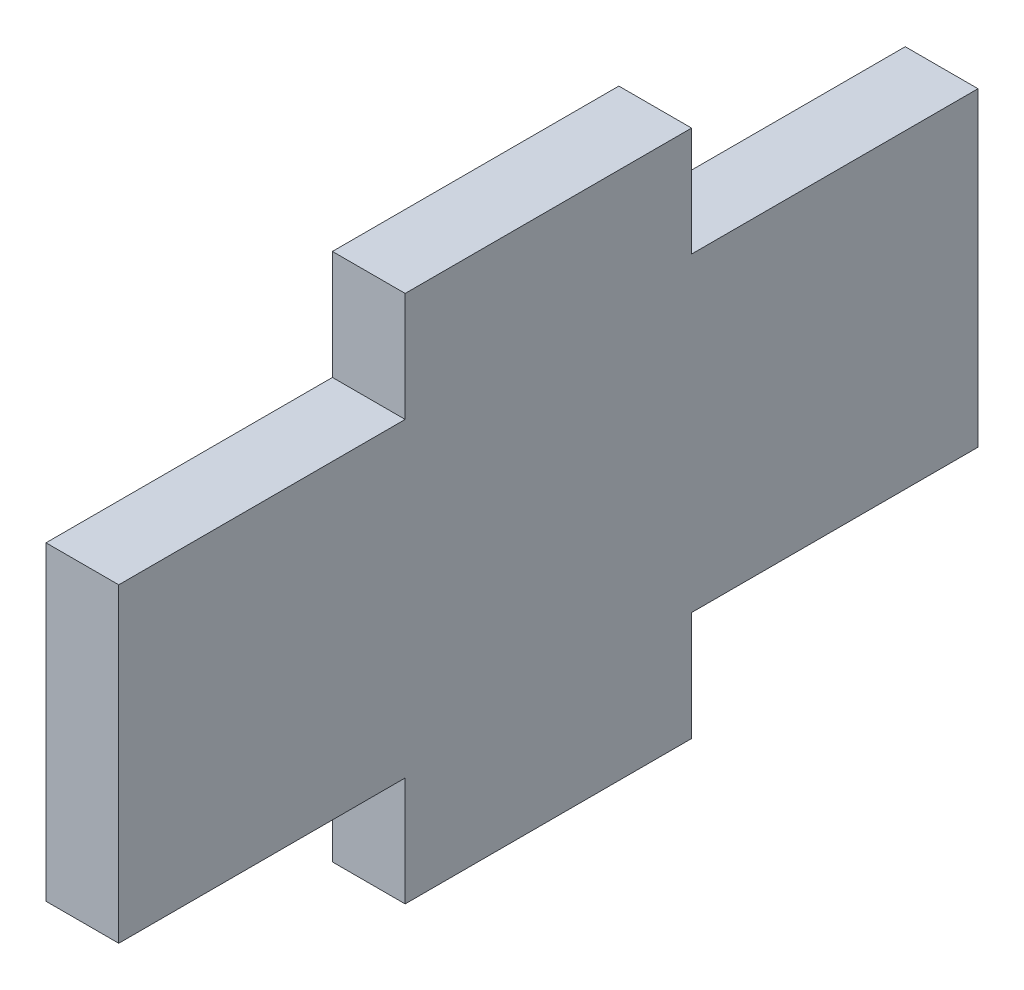
ISO-10303-21;
HEADER;
FILE_DESCRIPTION(('STEP AP214'),'2;1');
FILE_NAME('part.step','',(''),(''),'','','');
FILE_SCHEMA(('AUTOMOTIVE_DESIGN { 1 0 10303 214 1 1 1 1 }'));
ENDSEC;
DATA;
#1=APPLICATION_CONTEXT('core data for automotive mechanical design processes');
#2=APPLICATION_PROTOCOL_DEFINITION('international standard','automotive_design',2000,#1);
#3=PRODUCT_CONTEXT('',#1,'mechanical');
#4=PRODUCT('Part','Part','',(#3));
#5=PRODUCT_RELATED_PRODUCT_CATEGORY('part','',(#4));
#6=PRODUCT_DEFINITION_FORMATION('','',#4);
#7=PRODUCT_DEFINITION_CONTEXT('part definition',#1,'design');
#8=PRODUCT_DEFINITION('design','',#6,#7);
#9=PRODUCT_DEFINITION_SHAPE('','',#8);
#10=(LENGTH_UNIT() NAMED_UNIT(*) SI_UNIT(.MILLI.,.METRE.));
#11=(NAMED_UNIT(*) PLANE_ANGLE_UNIT() SI_UNIT($,.RADIAN.));
#12=(NAMED_UNIT(*) SI_UNIT($,.STERADIAN.) SOLID_ANGLE_UNIT());
#13=UNCERTAINTY_MEASURE_WITH_UNIT(LENGTH_MEASURE(1.E-05),#10,'distance_accuracy_value','');
#14=(GEOMETRIC_REPRESENTATION_CONTEXT(3) GLOBAL_UNCERTAINTY_ASSIGNED_CONTEXT((#13)) GLOBAL_UNIT_ASSIGNED_CONTEXT((#10,
#11,#12)) REPRESENTATION_CONTEXT('',''));
#15=CARTESIAN_POINT('',(0.,0.,0.));
#16=DIRECTION('',(0.,0.,1.));
#17=DIRECTION('',(1.,0.,0.));
#18=AXIS2_PLACEMENT_3D('',#15,#16,#17);
#19=CARTESIAN_POINT('',(3.175,13.55,-37.5));
#20=DIRECTION('',(0.,0.,1.));
#21=DIRECTION('',(1.,0.,0.));
#22=AXIS2_PLACEMENT_3D('',#19,#20,#21);
#23=PLANE('',#22);
#24=DIRECTION('',(0.,1.,0.));
#25=VECTOR('',#24,1.);
#26=CARTESIAN_POINT('',(-3.175,13.55,-37.5));
#27=LINE('',#26,#25);
#28=CARTESIAN_POINT('',(-3.175,-13.55,-37.5));
#29=VERTEX_POINT('',#28);
#30=CARTESIAN_POINT('',(-3.175,13.55,-37.5));
#31=VERTEX_POINT('',#30);
#32=EDGE_CURVE('E136',#29,#31,#27,.T.);
#33=ORIENTED_EDGE('',*,*,#32,.T.);
#34=DIRECTION('',(-1.,0.,0.));
#35=VECTOR('',#34,1.);
#36=CARTESIAN_POINT('',(3.175,13.55,-37.5));
#37=LINE('',#36,#35);
#38=CARTESIAN_POINT('',(3.175,13.55,-37.5));
#39=VERTEX_POINT('',#38);
#40=EDGE_CURVE('E11',#39,#31,#37,.T.);
#41=ORIENTED_EDGE('',*,*,#40,.F.);
#42=DIRECTION('',(0.,1.,0.));
#43=VECTOR('',#42,1.);
#44=CARTESIAN_POINT('',(3.175,13.55,-37.5));
#45=LINE('',#44,#43);
#46=CARTESIAN_POINT('',(3.175,-13.55,-37.5));
#47=VERTEX_POINT('',#46);
#48=EDGE_CURVE('E157',#47,#39,#45,.T.);
#49=ORIENTED_EDGE('',*,*,#48,.F.);
#50=DIRECTION('',(-1.,0.,0.));
#51=VECTOR('',#50,1.);
#52=CARTESIAN_POINT('',(3.175,-13.55,-37.5));
#53=LINE('',#52,#51);
#54=EDGE_CURVE('E257',#47,#29,#53,.T.);
#55=ORIENTED_EDGE('',*,*,#54,.T.);
#56=EDGE_LOOP('',(#33,#41,#49,#55));
#57=FACE_BOUND('',#56,.T.);
#58=ADVANCED_FACE('F39',(#57),#23,.F.);
#59=CARTESIAN_POINT('',(3.175,13.55,-12.5));
#60=DIRECTION('',(0.,-1.,0.));
#61=DIRECTION('',(0.,0.,-1.));
#62=AXIS2_PLACEMENT_3D('',#59,#60,#61);
#63=PLANE('',#62);
#64=DIRECTION('',(0.,0.,1.));
#65=VECTOR('',#64,1.);
#66=CARTESIAN_POINT('',(-3.175,13.55,-12.5));
#67=LINE('',#66,#65);
#68=CARTESIAN_POINT('',(-3.175,13.55,-12.5));
#69=VERTEX_POINT('',#68);
#70=EDGE_CURVE('E140',#31,#69,#67,.T.);
#71=ORIENTED_EDGE('',*,*,#70,.T.);
#72=DIRECTION('',(-1.,0.,0.));
#73=VECTOR('',#72,1.);
#74=CARTESIAN_POINT('',(3.175,13.55,-12.5));
#75=LINE('',#74,#73);
#76=CARTESIAN_POINT('',(3.175,13.55,-12.5));
#77=VERTEX_POINT('',#76);
#78=EDGE_CURVE('E48',#77,#69,#75,.T.);
#79=ORIENTED_EDGE('',*,*,#78,.F.);
#80=DIRECTION('',(0.,0.,1.));
#81=VECTOR('',#80,1.);
#82=CARTESIAN_POINT('',(3.175,13.55,-12.5));
#83=LINE('',#82,#81);
#84=EDGE_CURVE('E94',#39,#77,#83,.T.);
#85=ORIENTED_EDGE('',*,*,#84,.F.);
#86=ORIENTED_EDGE('',*,*,#40,.T.);
#87=EDGE_LOOP('',(#71,#79,#85,#86));
#88=FACE_BOUND('',#87,.T.);
#89=ADVANCED_FACE('F213',(#88),#63,.F.);
#90=CARTESIAN_POINT('',(3.175,23.075,-12.5));
#91=DIRECTION('',(0.,0.,1.));
#92=DIRECTION('',(1.,0.,0.));
#93=AXIS2_PLACEMENT_3D('',#90,#91,#92);
#94=PLANE('',#93);
#95=DIRECTION('',(0.,1.,0.));
#96=VECTOR('',#95,1.);
#97=CARTESIAN_POINT('',(-3.175,23.075,-12.5));
#98=LINE('',#97,#96);
#99=CARTESIAN_POINT('',(-3.175,23.075,-12.5));
#100=VERTEX_POINT('',#99);
#101=EDGE_CURVE('E144',#69,#100,#98,.T.);
#102=ORIENTED_EDGE('',*,*,#101,.T.);
#103=DIRECTION('',(-1.,0.,0.));
#104=VECTOR('',#103,1.);
#105=CARTESIAN_POINT('',(3.175,23.075,-12.5));
#106=LINE('',#105,#104);
#107=CARTESIAN_POINT('',(3.175,23.075,-12.5));
#108=VERTEX_POINT('',#107);
#109=EDGE_CURVE('E122',#108,#100,#106,.T.);
#110=ORIENTED_EDGE('',*,*,#109,.F.);
#111=DIRECTION('',(0.,1.,0.));
#112=VECTOR('',#111,1.);
#113=CARTESIAN_POINT('',(3.175,23.075,-12.5));
#114=LINE('',#113,#112);
#115=EDGE_CURVE('E111',#77,#108,#114,.T.);
#116=ORIENTED_EDGE('',*,*,#115,.F.);
#117=ORIENTED_EDGE('',*,*,#78,.T.);
#118=EDGE_LOOP('',(#102,#110,#116,#117));
#119=FACE_BOUND('',#118,.T.);
#120=ADVANCED_FACE('F167',(#119),#94,.F.);
#121=CARTESIAN_POINT('',(3.175,23.075,12.5));
#122=DIRECTION('',(0.,-1.,0.));
#123=DIRECTION('',(0.,0.,-1.));
#124=AXIS2_PLACEMENT_3D('',#121,#122,#123);
#125=PLANE('',#124);
#126=DIRECTION('',(0.,0.,1.));
#127=VECTOR('',#126,1.);
#128=CARTESIAN_POINT('',(-3.175,23.075,12.5));
#129=LINE('',#128,#127);
#130=CARTESIAN_POINT('',(-3.175,23.075,12.5));
#131=VERTEX_POINT('',#130);
#132=EDGE_CURVE('E120',#100,#131,#129,.T.);
#133=ORIENTED_EDGE('',*,*,#132,.T.);
#134=DIRECTION('',(-1.,0.,0.));
#135=VECTOR('',#134,1.);
#136=CARTESIAN_POINT('',(3.175,23.075,12.5));
#137=LINE('',#136,#135);
#138=CARTESIAN_POINT('',(3.175,23.075,12.5));
#139=VERTEX_POINT('',#138);
#140=EDGE_CURVE('E117',#139,#131,#137,.T.);
#141=ORIENTED_EDGE('',*,*,#140,.F.);
#142=DIRECTION('',(0.,0.,1.));
#143=VECTOR('',#142,1.);
#144=CARTESIAN_POINT('',(3.175,23.075,12.5));
#145=LINE('',#144,#143);
#146=EDGE_CURVE('E105',#108,#139,#145,.T.);
#147=ORIENTED_EDGE('',*,*,#146,.F.);
#148=ORIENTED_EDGE('',*,*,#109,.T.);
#149=EDGE_LOOP('',(#133,#141,#147,#148));
#150=FACE_BOUND('',#149,.T.);
#151=ADVANCED_FACE('F118',(#150),#125,.F.);
#152=CARTESIAN_POINT('',(3.175,13.55,12.5));
#153=DIRECTION('',(0.,0.,-1.));
#154=DIRECTION('',(-1.,0.,0.));
#155=AXIS2_PLACEMENT_3D('',#152,#153,#154);
#156=PLANE('',#155);
#157=DIRECTION('',(0.,-1.,0.));
#158=VECTOR('',#157,1.);
#159=CARTESIAN_POINT('',(-3.175,13.55,12.5));
#160=LINE('',#159,#158);
#161=CARTESIAN_POINT('',(-3.175,13.55,12.5));
#162=VERTEX_POINT('',#161);
#163=EDGE_CURVE('E80',#131,#162,#160,.T.);
#164=ORIENTED_EDGE('',*,*,#163,.T.);
#165=DIRECTION('',(-1.,0.,0.));
#166=VECTOR('',#165,1.);
#167=CARTESIAN_POINT('',(3.175,13.55,12.5));
#168=LINE('',#167,#166);
#169=CARTESIAN_POINT('',(3.175,13.55,12.5));
#170=VERTEX_POINT('',#169);
#171=EDGE_CURVE('E123',#170,#162,#168,.T.);
#172=ORIENTED_EDGE('',*,*,#171,.F.);
#173=DIRECTION('',(0.,-1.,0.));
#174=VECTOR('',#173,1.);
#175=CARTESIAN_POINT('',(3.175,13.55,12.5));
#176=LINE('',#175,#174);
#177=EDGE_CURVE('E109',#139,#170,#176,.T.);
#178=ORIENTED_EDGE('',*,*,#177,.F.);
#179=ORIENTED_EDGE('',*,*,#140,.T.);
#180=EDGE_LOOP('',(#164,#172,#178,#179));
#181=FACE_BOUND('',#180,.T.);
#182=ADVANCED_FACE('F125',(#181),#156,.F.);
#183=CARTESIAN_POINT('',(3.175,13.55,37.5));
#184=DIRECTION('',(0.,-1.,0.));
#185=DIRECTION('',(0.,0.,-1.));
#186=AXIS2_PLACEMENT_3D('',#183,#184,#185);
#187=PLANE('',#186);
#188=DIRECTION('',(0.,0.,1.));
#189=VECTOR('',#188,1.);
#190=CARTESIAN_POINT('',(-3.175,13.55,37.5));
#191=LINE('',#190,#189);
#192=CARTESIAN_POINT('',(-3.175,13.55,37.5));
#193=VERTEX_POINT('',#192);
#194=EDGE_CURVE('E86',#162,#193,#191,.T.);
#195=ORIENTED_EDGE('',*,*,#194,.T.);
#196=DIRECTION('',(-1.,0.,0.));
#197=VECTOR('',#196,1.);
#198=CARTESIAN_POINT('',(3.175,13.55,37.5));
#199=LINE('',#198,#197);
#200=CARTESIAN_POINT('',(3.175,13.55,37.5));
#201=VERTEX_POINT('',#200);
#202=EDGE_CURVE('E135',#201,#193,#199,.T.);
#203=ORIENTED_EDGE('',*,*,#202,.F.);
#204=DIRECTION('',(0.,0.,1.));
#205=VECTOR('',#204,1.);
#206=CARTESIAN_POINT('',(3.175,13.55,37.5));
#207=LINE('',#206,#205);
#208=EDGE_CURVE('E56',#170,#201,#207,.T.);
#209=ORIENTED_EDGE('',*,*,#208,.F.);
#210=ORIENTED_EDGE('',*,*,#171,.T.);
#211=EDGE_LOOP('',(#195,#203,#209,#210));
#212=FACE_BOUND('',#211,.T.);
#213=ADVANCED_FACE('F225',(#212),#187,.F.);
#214=CARTESIAN_POINT('',(3.175,0.,37.5));
#215=DIRECTION('',(0.,0.,-1.));
#216=DIRECTION('',(-1.,0.,0.));
#217=AXIS2_PLACEMENT_3D('',#214,#215,#216);
#218=PLANE('',#217);
#219=DIRECTION('',(0.,-1.,0.));
#220=VECTOR('',#219,1.);
#221=CARTESIAN_POINT('',(-3.175,0.,37.5));
#222=LINE('',#221,#220);
#223=CARTESIAN_POINT('',(-3.175,-13.55,37.5));
#224=VERTEX_POINT('',#223);
#225=EDGE_CURVE('E153',#193,#224,#222,.T.);
#226=ORIENTED_EDGE('',*,*,#225,.T.);
#227=DIRECTION('',(-1.,0.,0.));
#228=VECTOR('',#227,1.);
#229=CARTESIAN_POINT('',(3.175,-13.55,37.5));
#230=LINE('',#229,#228);
#231=CARTESIAN_POINT('',(3.175,-13.55,37.5));
#232=VERTEX_POINT('',#231);
#233=EDGE_CURVE('E141',#232,#224,#230,.T.);
#234=ORIENTED_EDGE('',*,*,#233,.F.);
#235=DIRECTION('',(0.,-1.,0.));
#236=VECTOR('',#235,1.);
#237=CARTESIAN_POINT('',(3.175,0.,37.5));
#238=LINE('',#237,#236);
#239=EDGE_CURVE('E129',#201,#232,#238,.T.);
#240=ORIENTED_EDGE('',*,*,#239,.F.);
#241=ORIENTED_EDGE('',*,*,#202,.T.);
#242=EDGE_LOOP('',(#226,#234,#240,#241));
#243=FACE_BOUND('',#242,.T.);
#244=ADVANCED_FACE('F180',(#243),#218,.F.);
#245=CARTESIAN_POINT('',(3.175,0.,0.));
#246=DIRECTION('',(1.,0.,0.));
#247=DIRECTION('',(0.,0.,-1.));
#248=AXIS2_PLACEMENT_3D('',#245,#246,#247);
#249=PLANE('',#248);
#250=ORIENTED_EDGE('',*,*,#48,.T.);
#251=ORIENTED_EDGE('',*,*,#84,.T.);
#252=ORIENTED_EDGE('',*,*,#115,.T.);
#253=ORIENTED_EDGE('',*,*,#146,.T.);
#254=ORIENTED_EDGE('',*,*,#177,.T.);
#255=ORIENTED_EDGE('',*,*,#208,.T.);
#256=ORIENTED_EDGE('',*,*,#239,.T.);
#257=DIRECTION('',(0.,0.,1.));
#258=VECTOR('',#257,1.);
#259=CARTESIAN_POINT('',(3.175,-13.55,37.5));
#260=LINE('',#259,#258);
#261=CARTESIAN_POINT('',(3.175,-13.55,12.5));
#262=VERTEX_POINT('',#261);
#263=EDGE_CURVE('E190',#262,#232,#260,.T.);
#264=ORIENTED_EDGE('',*,*,#263,.F.);
#265=DIRECTION('',(0.,1.,0.));
#266=VECTOR('',#265,1.);
#267=CARTESIAN_POINT('',(3.175,-13.55,12.5));
#268=LINE('',#267,#266);
#269=CARTESIAN_POINT('',(3.175,-23.075,12.5));
#270=VERTEX_POINT('',#269);
#271=EDGE_CURVE('E268',#270,#262,#268,.T.);
#272=ORIENTED_EDGE('',*,*,#271,.F.);
#273=DIRECTION('',(0.,0.,1.));
#274=VECTOR('',#273,1.);
#275=CARTESIAN_POINT('',(3.175,-23.075,12.5));
#276=LINE('',#275,#274);
#277=CARTESIAN_POINT('',(3.175,-23.075,-12.5));
#278=VERTEX_POINT('',#277);
#279=EDGE_CURVE('E293',#278,#270,#276,.T.);
#280=ORIENTED_EDGE('',*,*,#279,.F.);
#281=DIRECTION('',(0.,-1.,0.));
#282=VECTOR('',#281,1.);
#283=CARTESIAN_POINT('',(3.175,-23.075,-12.5));
#284=LINE('',#283,#282);
#285=CARTESIAN_POINT('',(3.175,-13.55,-12.5));
#286=VERTEX_POINT('',#285);
#287=EDGE_CURVE('E306',#286,#278,#284,.T.);
#288=ORIENTED_EDGE('',*,*,#287,.F.);
#289=DIRECTION('',(0.,0.,1.));
#290=VECTOR('',#289,1.);
#291=CARTESIAN_POINT('',(3.175,-13.55,-12.5));
#292=LINE('',#291,#290);
#293=EDGE_CURVE('E209',#47,#286,#292,.T.);
#294=ORIENTED_EDGE('',*,*,#293,.F.);
#295=EDGE_LOOP('',(#250,#251,#252,#253,#254,#255,#256,#264,#272,#280,#288,#294));
#296=FACE_BOUND('',#295,.T.);
#297=ADVANCED_FACE('F107',(#296),#249,.T.);
#298=CARTESIAN_POINT('',(-3.175,0.,0.));
#299=DIRECTION('',(1.,0.,0.));
#300=DIRECTION('',(0.,0.,-1.));
#301=AXIS2_PLACEMENT_3D('',#298,#299,#300);
#302=PLANE('',#301);
#303=ORIENTED_EDGE('',*,*,#32,.F.);
#304=DIRECTION('',(0.,0.,1.));
#305=VECTOR('',#304,1.);
#306=CARTESIAN_POINT('',(-3.175,-13.55,-12.5));
#307=LINE('',#306,#305);
#308=CARTESIAN_POINT('',(-3.175,-13.55,-12.5));
#309=VERTEX_POINT('',#308);
#310=EDGE_CURVE('E256',#29,#309,#307,.T.);
#311=ORIENTED_EDGE('',*,*,#310,.T.);
#312=DIRECTION('',(0.,-1.,0.));
#313=VECTOR('',#312,1.);
#314=CARTESIAN_POINT('',(-3.175,-23.075,-12.5));
#315=LINE('',#314,#313);
#316=CARTESIAN_POINT('',(-3.175,-23.075,-12.5));
#317=VERTEX_POINT('',#316);
#318=EDGE_CURVE('E264',#309,#317,#315,.T.);
#319=ORIENTED_EDGE('',*,*,#318,.T.);
#320=DIRECTION('',(0.,0.,1.));
#321=VECTOR('',#320,1.);
#322=CARTESIAN_POINT('',(-3.175,-23.075,12.5));
#323=LINE('',#322,#321);
#324=CARTESIAN_POINT('',(-3.175,-23.075,12.5));
#325=VERTEX_POINT('',#324);
#326=EDGE_CURVE('E270',#317,#325,#323,.T.);
#327=ORIENTED_EDGE('',*,*,#326,.T.);
#328=DIRECTION('',(0.,1.,0.));
#329=VECTOR('',#328,1.);
#330=CARTESIAN_POINT('',(-3.175,-13.55,12.5));
#331=LINE('',#330,#329);
#332=CARTESIAN_POINT('',(-3.175,-13.55,12.5));
#333=VERTEX_POINT('',#332);
#334=EDGE_CURVE('E297',#325,#333,#331,.T.);
#335=ORIENTED_EDGE('',*,*,#334,.T.);
#336=DIRECTION('',(0.,0.,1.));
#337=VECTOR('',#336,1.);
#338=CARTESIAN_POINT('',(-3.175,-13.55,37.5));
#339=LINE('',#338,#337);
#340=EDGE_CURVE('E176',#333,#224,#339,.T.);
#341=ORIENTED_EDGE('',*,*,#340,.T.);
#342=ORIENTED_EDGE('',*,*,#225,.F.);
#343=ORIENTED_EDGE('',*,*,#194,.F.);
#344=ORIENTED_EDGE('',*,*,#163,.F.);
#345=ORIENTED_EDGE('',*,*,#132,.F.);
#346=ORIENTED_EDGE('',*,*,#101,.F.);
#347=ORIENTED_EDGE('',*,*,#70,.F.);
#348=EDGE_LOOP('',(#303,#311,#319,#327,#335,#341,#342,#343,#344,#345,#346,#347));
#349=FACE_BOUND('',#348,.T.);
#350=ADVANCED_FACE('F170',(#349),#302,.F.);
#351=CARTESIAN_POINT('',(3.175,-13.55,37.5));
#352=DIRECTION('',(0.,-1.,0.));
#353=DIRECTION('',(0.,0.,-1.));
#354=AXIS2_PLACEMENT_3D('',#351,#352,#353);
#355=PLANE('',#354);
#356=ORIENTED_EDGE('',*,*,#340,.F.);
#357=DIRECTION('',(-1.,0.,0.));
#358=VECTOR('',#357,1.);
#359=CARTESIAN_POINT('',(3.175,-13.55,12.5));
#360=LINE('',#359,#358);
#361=EDGE_CURVE('E192',#262,#333,#360,.T.);
#362=ORIENTED_EDGE('',*,*,#361,.F.);
#363=ORIENTED_EDGE('',*,*,#263,.T.);
#364=ORIENTED_EDGE('',*,*,#233,.T.);
#365=EDGE_LOOP('',(#356,#362,#363,#364));
#366=FACE_BOUND('',#365,.T.);
#367=ADVANCED_FACE('F187',(#366),#355,.T.);
#368=CARTESIAN_POINT('',(3.175,-13.55,12.5));
#369=DIRECTION('',(0.,0.,1.));
#370=DIRECTION('',(1.,0.,0.));
#371=AXIS2_PLACEMENT_3D('',#368,#369,#370);
#372=PLANE('',#371);
#373=ORIENTED_EDGE('',*,*,#334,.F.);
#374=DIRECTION('',(-1.,0.,0.));
#375=VECTOR('',#374,1.);
#376=CARTESIAN_POINT('',(3.175,-23.075,12.5));
#377=LINE('',#376,#375);
#378=EDGE_CURVE('E196',#270,#325,#377,.T.);
#379=ORIENTED_EDGE('',*,*,#378,.F.);
#380=ORIENTED_EDGE('',*,*,#271,.T.);
#381=ORIENTED_EDGE('',*,*,#361,.T.);
#382=EDGE_LOOP('',(#373,#379,#380,#381));
#383=FACE_BOUND('',#382,.T.);
#384=ADVANCED_FACE('F236',(#383),#372,.T.);
#385=CARTESIAN_POINT('',(3.175,-23.075,12.5));
#386=DIRECTION('',(0.,-1.,0.));
#387=DIRECTION('',(0.,0.,-1.));
#388=AXIS2_PLACEMENT_3D('',#385,#386,#387);
#389=PLANE('',#388);
#390=ORIENTED_EDGE('',*,*,#326,.F.);
#391=DIRECTION('',(-1.,0.,0.));
#392=VECTOR('',#391,1.);
#393=CARTESIAN_POINT('',(3.175,-23.075,-12.5));
#394=LINE('',#393,#392);
#395=EDGE_CURVE('E278',#278,#317,#394,.T.);
#396=ORIENTED_EDGE('',*,*,#395,.F.);
#397=ORIENTED_EDGE('',*,*,#279,.T.);
#398=ORIENTED_EDGE('',*,*,#378,.T.);
#399=EDGE_LOOP('',(#390,#396,#397,#398));
#400=FACE_BOUND('',#399,.T.);
#401=ADVANCED_FACE('F239',(#400),#389,.T.);
#402=CARTESIAN_POINT('',(3.175,-23.075,-12.5));
#403=DIRECTION('',(0.,0.,-1.));
#404=DIRECTION('',(-1.,0.,0.));
#405=AXIS2_PLACEMENT_3D('',#402,#403,#404);
#406=PLANE('',#405);
#407=ORIENTED_EDGE('',*,*,#318,.F.);
#408=DIRECTION('',(-1.,0.,0.));
#409=VECTOR('',#408,1.);
#410=CARTESIAN_POINT('',(3.175,-13.55,-12.5));
#411=LINE('',#410,#409);
#412=EDGE_CURVE('E260',#286,#309,#411,.T.);
#413=ORIENTED_EDGE('',*,*,#412,.F.);
#414=ORIENTED_EDGE('',*,*,#287,.T.);
#415=ORIENTED_EDGE('',*,*,#395,.T.);
#416=EDGE_LOOP('',(#407,#413,#414,#415));
#417=FACE_BOUND('',#416,.T.);
#418=ADVANCED_FACE('F243',(#417),#406,.T.);
#419=CARTESIAN_POINT('',(3.175,-13.55,-12.5));
#420=DIRECTION('',(0.,-1.,0.));
#421=DIRECTION('',(0.,0.,-1.));
#422=AXIS2_PLACEMENT_3D('',#419,#420,#421);
#423=PLANE('',#422);
#424=ORIENTED_EDGE('',*,*,#310,.F.);
#425=ORIENTED_EDGE('',*,*,#54,.F.);
#426=ORIENTED_EDGE('',*,*,#293,.T.);
#427=ORIENTED_EDGE('',*,*,#412,.T.);
#428=EDGE_LOOP('',(#424,#425,#426,#427));
#429=FACE_BOUND('',#428,.T.);
#430=ADVANCED_FACE('F247',(#429),#423,.T.);
#431=CLOSED_SHELL('',(#58,#89,#120,#151,#182,#213,#244,#297,#350,#367,#384,#401,#418,#430));
#432=MANIFOLD_SOLID_BREP('B2',#431);
#433=ADVANCED_BREP_SHAPE_REPRESENTATION('',(#18,#432),#14);
#434=SHAPE_DEFINITION_REPRESENTATION(#9,#433);
ENDSEC;
END-ISO-10303-21;
